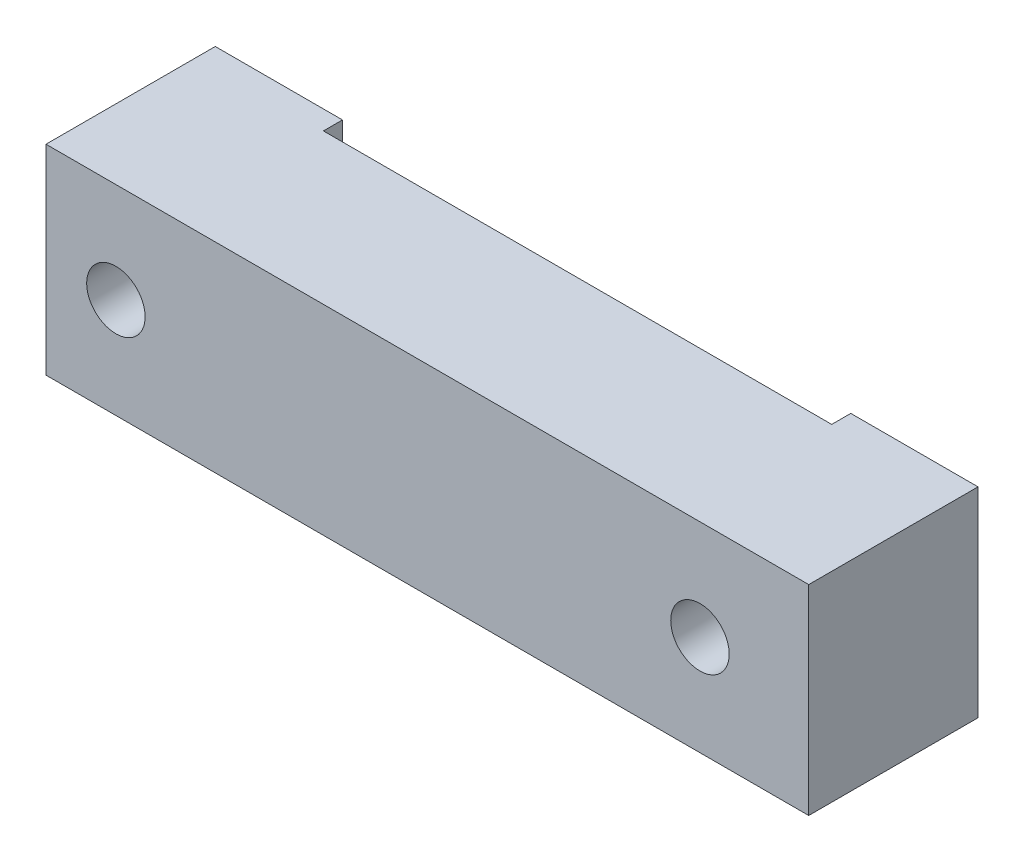
ISO-10303-21;
HEADER;
FILE_DESCRIPTION(('STEP AP214'),'2;1');
FILE_NAME('part.step','',(''),(''),'','','');
FILE_SCHEMA(('AUTOMOTIVE_DESIGN { 1 0 10303 214 1 1 1 1 }'));
ENDSEC;
DATA;
#1=APPLICATION_CONTEXT('core data for automotive mechanical design processes');
#2=APPLICATION_PROTOCOL_DEFINITION('international standard','automotive_design',2000,#1);
#3=PRODUCT_CONTEXT('',#1,'mechanical');
#4=PRODUCT('Part','Part','',(#3));
#5=PRODUCT_RELATED_PRODUCT_CATEGORY('part','',(#4));
#6=PRODUCT_DEFINITION_FORMATION('','',#4);
#7=PRODUCT_DEFINITION_CONTEXT('part definition',#1,'design');
#8=PRODUCT_DEFINITION('design','',#6,#7);
#9=PRODUCT_DEFINITION_SHAPE('','',#8);
#10=(LENGTH_UNIT() NAMED_UNIT(*) SI_UNIT(.MILLI.,.METRE.));
#11=(NAMED_UNIT(*) PLANE_ANGLE_UNIT() SI_UNIT($,.RADIAN.));
#12=(NAMED_UNIT(*) SI_UNIT($,.STERADIAN.) SOLID_ANGLE_UNIT());
#13=UNCERTAINTY_MEASURE_WITH_UNIT(LENGTH_MEASURE(1.E-05),#10,'distance_accuracy_value','');
#14=(GEOMETRIC_REPRESENTATION_CONTEXT(3) GLOBAL_UNCERTAINTY_ASSIGNED_CONTEXT((#13)) GLOBAL_UNIT_ASSIGNED_CONTEXT((#10,
#11,#12)) REPRESENTATION_CONTEXT('',''));
#15=CARTESIAN_POINT('',(0.,0.,0.));
#16=DIRECTION('',(0.,0.,1.));
#17=DIRECTION('',(1.,0.,0.));
#18=AXIS2_PLACEMENT_3D('',#15,#16,#17);
#19=CARTESIAN_POINT('',(-10.,0.,0.));
#20=DIRECTION('',(-1.,0.,0.));
#21=DIRECTION('',(0.,0.,1.));
#22=AXIS2_PLACEMENT_3D('',#19,#20,#21);
#23=PLANE('',#22);
#24=DIRECTION('',(0.,0.,1.));
#25=VECTOR('',#24,1.);
#26=CARTESIAN_POINT('',(-10.,-3.935,0.));
#27=LINE('',#26,#25);
#28=CARTESIAN_POINT('',(-10.,-3.935,0.));
#29=VERTEX_POINT('',#28);
#30=CARTESIAN_POINT('',(-10.,-3.935,0.75));
#31=VERTEX_POINT('',#30);
#32=EDGE_CURVE('E140',#29,#31,#27,.T.);
#33=ORIENTED_EDGE('',*,*,#32,.F.);
#34=DIRECTION('',(0.,1.,0.));
#35=VECTOR('',#34,1.);
#36=CARTESIAN_POINT('',(-10.,0.,0.));
#37=LINE('',#36,#35);
#38=CARTESIAN_POINT('',(-10.,3.935,0.));
#39=VERTEX_POINT('',#38);
#40=EDGE_CURVE('E108',#39,#29,#37,.F.);
#41=ORIENTED_EDGE('',*,*,#40,.F.);
#42=DIRECTION('',(0.,0.,1.));
#43=VECTOR('',#42,1.);
#44=CARTESIAN_POINT('',(-10.,3.935,0.));
#45=LINE('',#44,#43);
#46=CARTESIAN_POINT('',(-10.,3.935,0.75));
#47=VERTEX_POINT('',#46);
#48=EDGE_CURVE('E138',#47,#39,#45,.F.);
#49=ORIENTED_EDGE('',*,*,#48,.F.);
#50=DIRECTION('',(0.,1.,0.));
#51=VECTOR('',#50,1.);
#52=CARTESIAN_POINT('',(-10.,0.,0.75));
#53=LINE('',#52,#51);
#54=EDGE_CURVE('E118',#47,#31,#53,.F.);
#55=ORIENTED_EDGE('',*,*,#54,.T.);
#56=EDGE_LOOP('',(#33,#41,#49,#55));
#57=FACE_BOUND('',#56,.T.);
#58=ADVANCED_FACE('F17',(#57),#23,.F.);
#59=CARTESIAN_POINT('',(10.,0.,0.));
#60=DIRECTION('',(-1.,0.,0.));
#61=DIRECTION('',(0.,0.,1.));
#62=AXIS2_PLACEMENT_3D('',#59,#60,#61);
#63=PLANE('',#62);
#64=DIRECTION('',(0.,1.,0.));
#65=VECTOR('',#64,1.);
#66=CARTESIAN_POINT('',(10.,0.,0.));
#67=LINE('',#66,#65);
#68=CARTESIAN_POINT('',(10.,0.892103845749723,0.));
#69=VERTEX_POINT('',#68);
#70=CARTESIAN_POINT('',(10.,3.935,0.));
#71=VERTEX_POINT('',#70);
#72=EDGE_CURVE('E117',#69,#71,#67,.T.);
#73=ORIENTED_EDGE('',*,*,#72,.F.);
#74=DIRECTION('',(0.,0.,1.));
#75=VECTOR('',#74,1.);
#76=CARTESIAN_POINT('',(10.,0.892103845734,0.));
#77=LINE('',#76,#75);
#78=CARTESIAN_POINT('',(10.,0.892103845749723,0.75));
#79=VERTEX_POINT('',#78);
#80=EDGE_CURVE('E91',#69,#79,#77,.T.);
#81=ORIENTED_EDGE('',*,*,#80,.T.);
#82=DIRECTION('',(0.,1.,0.));
#83=VECTOR('',#82,1.);
#84=CARTESIAN_POINT('',(10.,0.,0.75));
#85=LINE('',#84,#83);
#86=CARTESIAN_POINT('',(10.,3.935,0.75));
#87=VERTEX_POINT('',#86);
#88=EDGE_CURVE('E122',#79,#87,#85,.T.);
#89=ORIENTED_EDGE('',*,*,#88,.T.);
#90=DIRECTION('',(0.,0.,1.));
#91=VECTOR('',#90,1.);
#92=CARTESIAN_POINT('',(10.,3.935,0.));
#93=LINE('',#92,#91);
#94=EDGE_CURVE('E142',#87,#71,#93,.F.);
#95=ORIENTED_EDGE('',*,*,#94,.T.);
#96=EDGE_LOOP('',(#73,#81,#89,#95));
#97=FACE_BOUND('',#96,.T.);
#98=ADVANCED_FACE('F256',(#97),#63,.T.);
#99=CARTESIAN_POINT('',(10.,0.,0.));
#100=DIRECTION('',(-1.,0.,0.));
#101=DIRECTION('',(0.,0.,1.));
#102=AXIS2_PLACEMENT_3D('',#99,#100,#101);
#103=PLANE('',#102);
#104=DIRECTION('',(0.,1.,0.));
#105=VECTOR('',#104,1.);
#106=CARTESIAN_POINT('',(10.,0.,0.75));
#107=LINE('',#106,#105);
#108=CARTESIAN_POINT('',(10.,-3.935,0.75));
#109=VERTEX_POINT('',#108);
#110=CARTESIAN_POINT('',(10.,-0.892103845749723,0.75));
#111=VERTEX_POINT('',#110);
#112=EDGE_CURVE('E112',#109,#111,#107,.T.);
#113=ORIENTED_EDGE('',*,*,#112,.T.);
#114=DIRECTION('',(0.,0.,1.));
#115=VECTOR('',#114,1.);
#116=CARTESIAN_POINT('',(10.,-0.892103845734,0.));
#117=LINE('',#116,#115);
#118=CARTESIAN_POINT('',(10.,-0.892103845749723,0.));
#119=VERTEX_POINT('',#118);
#120=EDGE_CURVE('E97',#111,#119,#117,.F.);
#121=ORIENTED_EDGE('',*,*,#120,.T.);
#122=DIRECTION('',(0.,1.,0.));
#123=VECTOR('',#122,1.);
#124=CARTESIAN_POINT('',(10.,0.,0.));
#125=LINE('',#124,#123);
#126=CARTESIAN_POINT('',(10.,-3.935,0.));
#127=VERTEX_POINT('',#126);
#128=EDGE_CURVE('E178',#127,#119,#125,.T.);
#129=ORIENTED_EDGE('',*,*,#128,.F.);
#130=DIRECTION('',(0.,0.,1.));
#131=VECTOR('',#130,1.);
#132=CARTESIAN_POINT('',(10.,-3.935,0.));
#133=LINE('',#132,#131);
#134=EDGE_CURVE('E109',#127,#109,#133,.T.);
#135=ORIENTED_EDGE('',*,*,#134,.T.);
#136=EDGE_LOOP('',(#113,#121,#129,#135));
#137=FACE_BOUND('',#136,.T.);
#138=ADVANCED_FACE('F113',(#137),#103,.T.);
#139=CARTESIAN_POINT('',(15.005,0.,0.));
#140=DIRECTION('',(0.,0.,-1.));
#141=DIRECTION('',(-1.,0.,0.));
#142=AXIS2_PLACEMENT_3D('',#139,#140,#141);
#143=PLANE('',#142);
#144=CARTESIAN_POINT('',(-12.255,0.,0.));
#145=DIRECTION('',(0.,0.,-1.));
#146=DIRECTION('',(-1.,0.,0.));
#147=AXIS2_PLACEMENT_3D('',#144,#145,#146);
#148=CIRCLE('',#147,1.15);
#149=CARTESIAN_POINT('',(-13.405,0.,0.));
#150=VERTEX_POINT('',#149);
#151=EDGE_CURVE('E20',#150,#150,#148,.F.);
#152=ORIENTED_EDGE('',*,*,#151,.T.);
#153=EDGE_LOOP('',(#152));
#154=FACE_BOUND('',#153,.T.);
#155=DIRECTION('',(0.,1.,0.));
#156=VECTOR('',#155,1.);
#157=CARTESIAN_POINT('',(-15.005,0.,0.));
#158=LINE('',#157,#156);
#159=CARTESIAN_POINT('',(-15.005,-3.935,0.));
#160=VERTEX_POINT('',#159);
#161=CARTESIAN_POINT('',(-15.005,3.935,0.));
#162=VERTEX_POINT('',#161);
#163=EDGE_CURVE('E161',#160,#162,#158,.T.);
#164=ORIENTED_EDGE('',*,*,#163,.T.);
#165=DIRECTION('',(1.,0.,0.));
#166=VECTOR('',#165,1.);
#167=CARTESIAN_POINT('',(0.,3.935,0.));
#168=LINE('',#167,#166);
#169=EDGE_CURVE('E136',#39,#162,#168,.F.);
#170=ORIENTED_EDGE('',*,*,#169,.F.);
#171=ORIENTED_EDGE('',*,*,#40,.T.);
#172=DIRECTION('',(1.,0.,0.));
#173=VECTOR('',#172,1.);
#174=CARTESIAN_POINT('',(0.,-3.935,0.));
#175=LINE('',#174,#173);
#176=EDGE_CURVE('E147',#29,#160,#175,.F.);
#177=ORIENTED_EDGE('',*,*,#176,.T.);
#178=EDGE_LOOP('',(#164,#170,#171,#177));
#179=FACE_BOUND('',#178,.T.);
#180=ADVANCED_FACE('F249',(#154,#179),#143,.T.);
#181=CARTESIAN_POINT('',(-10.,0.,0.75));
#182=DIRECTION('',(0.,0.,1.));
#183=DIRECTION('',(1.,0.,0.));
#184=AXIS2_PLACEMENT_3D('',#181,#182,#183);
#185=PLANE('',#184);
#186=ORIENTED_EDGE('',*,*,#112,.F.);
#187=DIRECTION('',(1.,0.,0.));
#188=VECTOR('',#187,1.);
#189=CARTESIAN_POINT('',(0.,-3.935,0.75));
#190=LINE('',#189,#188);
#191=EDGE_CURVE('E145',#109,#31,#190,.F.);
#192=ORIENTED_EDGE('',*,*,#191,.T.);
#193=ORIENTED_EDGE('',*,*,#54,.F.);
#194=DIRECTION('',(1.,0.,0.));
#195=VECTOR('',#194,1.);
#196=CARTESIAN_POINT('',(0.,3.935,0.75));
#197=LINE('',#196,#195);
#198=EDGE_CURVE('E133',#87,#47,#197,.F.);
#199=ORIENTED_EDGE('',*,*,#198,.F.);
#200=ORIENTED_EDGE('',*,*,#88,.F.);
#201=CARTESIAN_POINT('',(10.7257070541,0.,0.75));
#202=DIRECTION('',(0.,0.,-1.));
#203=DIRECTION('',(-1.,0.,0.));
#204=AXIS2_PLACEMENT_3D('',#201,#202,#203);
#205=CIRCLE('',#204,1.15);
#206=EDGE_CURVE('E102',#79,#111,#205,.F.);
#207=ORIENTED_EDGE('',*,*,#206,.T.);
#208=EDGE_LOOP('',(#186,#192,#193,#199,#200,#207));
#209=FACE_BOUND('',#208,.T.);
#210=ADVANCED_FACE('F120',(#209),#185,.F.);
#211=CARTESIAN_POINT('',(15.005,0.,0.));
#212=DIRECTION('',(0.,0.,-1.));
#213=DIRECTION('',(-1.,0.,0.));
#214=AXIS2_PLACEMENT_3D('',#211,#212,#213);
#215=PLANE('',#214);
#216=ORIENTED_EDGE('',*,*,#128,.T.);
#217=CARTESIAN_POINT('',(10.7257070541,0.,0.));
#218=DIRECTION('',(0.,0.,-1.));
#219=DIRECTION('',(-1.,0.,0.));
#220=AXIS2_PLACEMENT_3D('',#217,#218,#219);
#221=CIRCLE('',#220,1.15);
#222=EDGE_CURVE('E104',#119,#69,#221,.F.);
#223=ORIENTED_EDGE('',*,*,#222,.T.);
#224=ORIENTED_EDGE('',*,*,#72,.T.);
#225=DIRECTION('',(1.,0.,0.));
#226=VECTOR('',#225,1.);
#227=CARTESIAN_POINT('',(0.,3.935,0.));
#228=LINE('',#227,#226);
#229=CARTESIAN_POINT('',(15.005,3.935,0.));
#230=VERTEX_POINT('',#229);
#231=EDGE_CURVE('E137',#230,#71,#228,.F.);
#232=ORIENTED_EDGE('',*,*,#231,.F.);
#233=DIRECTION('',(0.,1.,0.));
#234=VECTOR('',#233,1.);
#235=CARTESIAN_POINT('',(15.005,0.,0.));
#236=LINE('',#235,#234);
#237=CARTESIAN_POINT('',(15.005,-3.935,0.));
#238=VERTEX_POINT('',#237);
#239=EDGE_CURVE('E189',#238,#230,#236,.T.);
#240=ORIENTED_EDGE('',*,*,#239,.F.);
#241=DIRECTION('',(1.,0.,0.));
#242=VECTOR('',#241,1.);
#243=CARTESIAN_POINT('',(0.,-3.935,0.));
#244=LINE('',#243,#242);
#245=EDGE_CURVE('E148',#238,#127,#244,.F.);
#246=ORIENTED_EDGE('',*,*,#245,.T.);
#247=EDGE_LOOP('',(#216,#223,#224,#232,#240,#246));
#248=FACE_BOUND('',#247,.T.);
#249=ADVANCED_FACE('F266',(#248),#215,.T.);
#250=CARTESIAN_POINT('',(-15.005,0.,6.66));
#251=DIRECTION('',(1.,0.,0.));
#252=DIRECTION('',(0.,0.,-1.));
#253=AXIS2_PLACEMENT_3D('',#250,#251,#252);
#254=PLANE('',#253);
#255=DIRECTION('',(0.,0.,1.));
#256=VECTOR('',#255,1.);
#257=CARTESIAN_POINT('',(-15.005,-3.935,0.));
#258=LINE('',#257,#256);
#259=CARTESIAN_POINT('',(-15.005,-3.935,6.66));
#260=VERTEX_POINT('',#259);
#261=EDGE_CURVE('E184',#160,#260,#258,.T.);
#262=ORIENTED_EDGE('',*,*,#261,.T.);
#263=DIRECTION('',(0.,1.,0.));
#264=VECTOR('',#263,1.);
#265=CARTESIAN_POINT('',(-15.005,0.,6.66));
#266=LINE('',#265,#264);
#267=CARTESIAN_POINT('',(-15.005,3.935,6.66));
#268=VERTEX_POINT('',#267);
#269=EDGE_CURVE('E123',#268,#260,#266,.F.);
#270=ORIENTED_EDGE('',*,*,#269,.F.);
#271=DIRECTION('',(0.,0.,1.));
#272=VECTOR('',#271,1.);
#273=CARTESIAN_POINT('',(-15.005,3.935,0.));
#274=LINE('',#273,#272);
#275=EDGE_CURVE('E126',#162,#268,#274,.T.);
#276=ORIENTED_EDGE('',*,*,#275,.F.);
#277=ORIENTED_EDGE('',*,*,#163,.F.);
#278=EDGE_LOOP('',(#262,#270,#276,#277));
#279=FACE_BOUND('',#278,.T.);
#280=ADVANCED_FACE('F213',(#279),#254,.F.);
#281=CARTESIAN_POINT('',(0.,-3.935,0.));
#282=DIRECTION('',(0.,1.,0.));
#283=DIRECTION('',(0.,0.,1.));
#284=AXIS2_PLACEMENT_3D('',#281,#282,#283);
#285=PLANE('',#284);
#286=ORIENTED_EDGE('',*,*,#176,.F.);
#287=ORIENTED_EDGE('',*,*,#32,.T.);
#288=ORIENTED_EDGE('',*,*,#191,.F.);
#289=ORIENTED_EDGE('',*,*,#134,.F.);
#290=ORIENTED_EDGE('',*,*,#245,.F.);
#291=DIRECTION('',(0.,0.,-1.));
#292=VECTOR('',#291,1.);
#293=CARTESIAN_POINT('',(15.005,-3.935,6.66));
#294=LINE('',#293,#292);
#295=CARTESIAN_POINT('',(15.005,-3.935,6.66));
#296=VERTEX_POINT('',#295);
#297=EDGE_CURVE('E186',#296,#238,#294,.T.);
#298=ORIENTED_EDGE('',*,*,#297,.F.);
#299=DIRECTION('',(1.,0.,0.));
#300=VECTOR('',#299,1.);
#301=CARTESIAN_POINT('',(-15.005,-3.935,6.66));
#302=LINE('',#301,#300);
#303=EDGE_CURVE('E198',#260,#296,#302,.T.);
#304=ORIENTED_EDGE('',*,*,#303,.F.);
#305=ORIENTED_EDGE('',*,*,#261,.F.);
#306=EDGE_LOOP('',(#286,#287,#288,#289,#290,#298,#304,#305));
#307=FACE_BOUND('',#306,.T.);
#308=ADVANCED_FACE('F218',(#307),#285,.F.);
#309=CARTESIAN_POINT('',(15.005,0.,6.66));
#310=DIRECTION('',(1.,0.,0.));
#311=DIRECTION('',(0.,0.,-1.));
#312=AXIS2_PLACEMENT_3D('',#309,#310,#311);
#313=PLANE('',#312);
#314=ORIENTED_EDGE('',*,*,#239,.T.);
#315=DIRECTION('',(0.,0.,1.));
#316=VECTOR('',#315,1.);
#317=CARTESIAN_POINT('',(15.005,3.935,0.));
#318=LINE('',#317,#316);
#319=CARTESIAN_POINT('',(15.005,3.935,6.66));
#320=VERTEX_POINT('',#319);
#321=EDGE_CURVE('E35',#320,#230,#318,.F.);
#322=ORIENTED_EDGE('',*,*,#321,.F.);
#323=DIRECTION('',(0.,1.,0.));
#324=VECTOR('',#323,1.);
#325=CARTESIAN_POINT('',(15.005,0.,6.66));
#326=LINE('',#325,#324);
#327=EDGE_CURVE('E201',#296,#320,#326,.T.);
#328=ORIENTED_EDGE('',*,*,#327,.F.);
#329=ORIENTED_EDGE('',*,*,#297,.T.);
#330=EDGE_LOOP('',(#314,#322,#328,#329));
#331=FACE_BOUND('',#330,.T.);
#332=ADVANCED_FACE('F220',(#331),#313,.T.);
#333=CARTESIAN_POINT('',(0.,3.935,0.));
#334=DIRECTION('',(0.,1.,0.));
#335=DIRECTION('',(0.,0.,1.));
#336=AXIS2_PLACEMENT_3D('',#333,#334,#335);
#337=PLANE('',#336);
#338=ORIENTED_EDGE('',*,*,#169,.T.);
#339=ORIENTED_EDGE('',*,*,#275,.T.);
#340=DIRECTION('',(1.,0.,0.));
#341=VECTOR('',#340,1.);
#342=CARTESIAN_POINT('',(-15.005,3.935,6.66));
#343=LINE('',#342,#341);
#344=EDGE_CURVE('E129',#320,#268,#343,.F.);
#345=ORIENTED_EDGE('',*,*,#344,.F.);
#346=ORIENTED_EDGE('',*,*,#321,.T.);
#347=ORIENTED_EDGE('',*,*,#231,.T.);
#348=ORIENTED_EDGE('',*,*,#94,.F.);
#349=ORIENTED_EDGE('',*,*,#198,.T.);
#350=ORIENTED_EDGE('',*,*,#48,.T.);
#351=EDGE_LOOP('',(#338,#339,#345,#346,#347,#348,#349,#350));
#352=FACE_BOUND('',#351,.T.);
#353=ADVANCED_FACE('F208',(#352),#337,.T.);
#354=CARTESIAN_POINT('',(-12.255,0.,6.56));
#355=DIRECTION('',(0.,0.,-1.));
#356=DIRECTION('',(-1.,0.,0.));
#357=AXIS2_PLACEMENT_3D('',#354,#355,#356);
#358=CYLINDRICAL_SURFACE('',#357,1.15);
#359=ORIENTED_EDGE('',*,*,#151,.F.);
#360=EDGE_LOOP('',(#359));
#361=FACE_BOUND('',#360,.T.);
#362=CARTESIAN_POINT('',(-12.255,0.,6.66));
#363=DIRECTION('',(0.,0.,-1.));
#364=DIRECTION('',(-1.,0.,0.));
#365=AXIS2_PLACEMENT_3D('',#362,#363,#364);
#366=CIRCLE('',#365,1.15);
#367=CARTESIAN_POINT('',(-13.405,0.,6.66));
#368=VERTEX_POINT('',#367);
#369=EDGE_CURVE('E26',#368,#368,#366,.T.);
#370=ORIENTED_EDGE('',*,*,#369,.F.);
#371=EDGE_LOOP('',(#370));
#372=FACE_BOUND('',#371,.T.);
#373=ADVANCED_FACE('F229',(#361,#372),#358,.F.);
#374=CARTESIAN_POINT('',(10.7257070541,0.,6.56));
#375=DIRECTION('',(0.,0.,-1.));
#376=DIRECTION('',(-1.,0.,0.));
#377=AXIS2_PLACEMENT_3D('',#374,#375,#376);
#378=CYLINDRICAL_SURFACE('',#377,1.15);
#379=ORIENTED_EDGE('',*,*,#120,.F.);
#380=ORIENTED_EDGE('',*,*,#206,.F.);
#381=ORIENTED_EDGE('',*,*,#80,.F.);
#382=ORIENTED_EDGE('',*,*,#222,.F.);
#383=EDGE_LOOP('',(#379,#380,#381,#382));
#384=FACE_BOUND('',#383,.T.);
#385=CARTESIAN_POINT('',(10.7257070541,0.,6.66));
#386=DIRECTION('',(0.,0.,-1.));
#387=DIRECTION('',(-1.,0.,0.));
#388=AXIS2_PLACEMENT_3D('',#385,#386,#387);
#389=CIRCLE('',#388,1.15);
#390=CARTESIAN_POINT('',(9.5757070541,0.,6.66));
#391=VERTEX_POINT('',#390);
#392=EDGE_CURVE('E11',#391,#391,#389,.T.);
#393=ORIENTED_EDGE('',*,*,#392,.F.);
#394=EDGE_LOOP('',(#393));
#395=FACE_BOUND('',#394,.T.);
#396=ADVANCED_FACE('F99',(#384,#395),#378,.F.);
#397=CARTESIAN_POINT('',(-15.005,0.,6.66));
#398=DIRECTION('',(0.,0.,1.));
#399=DIRECTION('',(1.,0.,0.));
#400=AXIS2_PLACEMENT_3D('',#397,#398,#399);
#401=PLANE('',#400);
#402=ORIENTED_EDGE('',*,*,#392,.T.);
#403=EDGE_LOOP('',(#402));
#404=FACE_BOUND('',#403,.T.);
#405=ORIENTED_EDGE('',*,*,#369,.T.);
#406=EDGE_LOOP('',(#405));
#407=FACE_BOUND('',#406,.T.);
#408=ORIENTED_EDGE('',*,*,#327,.T.);
#409=ORIENTED_EDGE('',*,*,#344,.T.);
#410=ORIENTED_EDGE('',*,*,#269,.T.);
#411=ORIENTED_EDGE('',*,*,#303,.T.);
#412=EDGE_LOOP('',(#408,#409,#410,#411));
#413=FACE_BOUND('',#412,.T.);
#414=ADVANCED_FACE('F206',(#404,#407,#413),#401,.T.);
#415=CLOSED_SHELL('',(#58,#98,#138,#180,#210,#249,#280,#308,#332,#353,#373,#396,#414));
#416=MANIFOLD_SOLID_BREP('B1',#415);
#417=ADVANCED_BREP_SHAPE_REPRESENTATION('',(#18,#416),#14);
#418=SHAPE_DEFINITION_REPRESENTATION(#9,#417);
ENDSEC;
END-ISO-10303-21;
